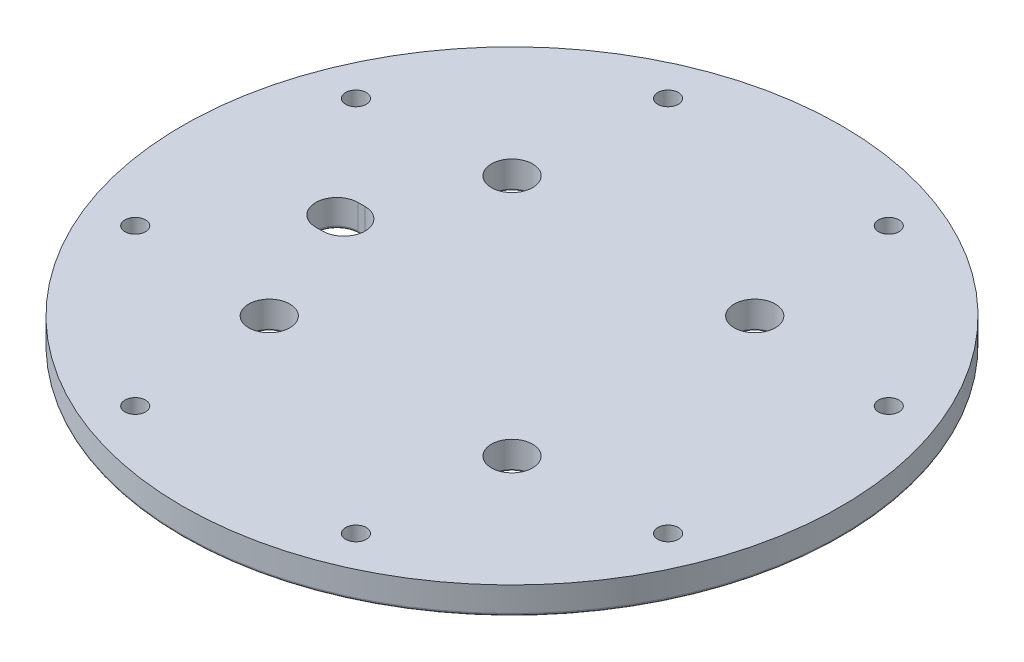
ISO-10303-21;
HEADER;
FILE_DESCRIPTION(('STEP AP214'),'2;1');
FILE_NAME('part.step','',(''),(''),'','','');
FILE_SCHEMA(('AUTOMOTIVE_DESIGN { 1 0 10303 214 1 1 1 1 }'));
ENDSEC;
DATA;
#1=APPLICATION_CONTEXT('core data for automotive mechanical design processes');
#2=APPLICATION_PROTOCOL_DEFINITION('international standard','automotive_design',2000,#1);
#3=PRODUCT_CONTEXT('',#1,'mechanical');
#4=PRODUCT('Part','Part','',(#3));
#5=PRODUCT_RELATED_PRODUCT_CATEGORY('part','',(#4));
#6=PRODUCT_DEFINITION_FORMATION('','',#4);
#7=PRODUCT_DEFINITION_CONTEXT('part definition',#1,'design');
#8=PRODUCT_DEFINITION('design','',#6,#7);
#9=PRODUCT_DEFINITION_SHAPE('','',#8);
#10=(LENGTH_UNIT() NAMED_UNIT(*) SI_UNIT(.MILLI.,.METRE.));
#11=(NAMED_UNIT(*) PLANE_ANGLE_UNIT() SI_UNIT($,.RADIAN.));
#12=(NAMED_UNIT(*) SI_UNIT($,.STERADIAN.) SOLID_ANGLE_UNIT());
#13=UNCERTAINTY_MEASURE_WITH_UNIT(LENGTH_MEASURE(1.E-05),#10,'distance_accuracy_value','');
#14=(GEOMETRIC_REPRESENTATION_CONTEXT(3) GLOBAL_UNCERTAINTY_ASSIGNED_CONTEXT((#13)) GLOBAL_UNIT_ASSIGNED_CONTEXT((#10,
#11,#12)) REPRESENTATION_CONTEXT('',''));
#15=CARTESIAN_POINT('',(0.,0.,0.));
#16=DIRECTION('',(0.,0.,1.));
#17=DIRECTION('',(1.,0.,0.));
#18=AXIS2_PLACEMENT_3D('',#15,#16,#17);
#19=CARTESIAN_POINT('',(0.,2.5,0.));
#20=DIRECTION('',(0.,-1.,0.));
#21=DIRECTION('',(0.,0.,-1.));
#22=AXIS2_PLACEMENT_3D('',#19,#20,#21);
#23=PLANE('',#22);
#24=CARTESIAN_POINT('',(0.,2.5,0.));
#25=DIRECTION('',(0.,-1.,0.));
#26=DIRECTION('',(0.,0.,-1.));
#27=AXIS2_PLACEMENT_3D('',#24,#25,#26);
#28=CIRCLE('',#27,16.);
#29=CARTESIAN_POINT('',(0.,2.5,-16.));
#30=VERTEX_POINT('',#29);
#31=EDGE_CURVE('E779',#30,#30,#28,.T.);
#32=ORIENTED_EDGE('',*,*,#31,.T.);
#33=EDGE_LOOP('',(#32));
#34=FACE_BOUND('',#33,.T.);
#35=ADVANCED_FACE('F17',(#34),#23,.T.);
#36=CARTESIAN_POINT('',(0.,2.5,0.));
#37=DIRECTION('',(0.,-1.,0.));
#38=DIRECTION('',(0.,0.,-1.));
#39=AXIS2_PLACEMENT_3D('',#36,#37,#38);
#40=CYLINDRICAL_SURFACE('',#39,16.);
#41=ORIENTED_EDGE('',*,*,#31,.F.);
#42=EDGE_LOOP('',(#41));
#43=FACE_BOUND('',#42,.T.);
#44=CARTESIAN_POINT('',(0.,0.4,0.));
#45=DIRECTION('',(0.,1.,0.));
#46=DIRECTION('',(0.,0.,1.));
#47=AXIS2_PLACEMENT_3D('',#44,#45,#46);
#48=CIRCLE('',#47,16.);
#49=CARTESIAN_POINT('',(0.,0.4,16.));
#50=VERTEX_POINT('',#49);
#51=EDGE_CURVE('E334',#50,#50,#48,.T.);
#52=ORIENTED_EDGE('',*,*,#51,.F.);
#53=EDGE_LOOP('',(#52));
#54=FACE_BOUND('',#53,.T.);
#55=ADVANCED_FACE('F850',(#43,#54),#40,.F.);
#56=CARTESIAN_POINT('',(0.,0.4,0.));
#57=DIRECTION('',(0.,1.,0.));
#58=DIRECTION('',(0.,0.,1.));
#59=AXIS2_PLACEMENT_3D('',#56,#57,#58);
#60=TOROIDAL_SURFACE('',#59,16.4,0.4);
#61=CARTESIAN_POINT('',(0.,0.,0.));
#62=DIRECTION('',(0.,-1.,0.));
#63=DIRECTION('',(0.,0.,1.));
#64=AXIS2_PLACEMENT_3D('',#61,#62,#63);
#65=CIRCLE('',#64,16.4);
#66=CARTESIAN_POINT('',(0.,0.,16.4));
#67=VERTEX_POINT('',#66);
#68=CARTESIAN_POINT('',(0.,0.,-16.4));
#69=VERTEX_POINT('',#68);
#70=EDGE_CURVE('E134',#67,#69,#65,.T.);
#71=ORIENTED_EDGE('',*,*,#70,.T.);
#72=CARTESIAN_POINT('',(0.,0.,0.));
#73=DIRECTION('',(0.,-1.,0.));
#74=DIRECTION('',(0.,0.,-1.));
#75=AXIS2_PLACEMENT_3D('',#72,#73,#74);
#76=CIRCLE('',#75,16.4);
#77=EDGE_CURVE('E138',#69,#67,#76,.T.);
#78=ORIENTED_EDGE('',*,*,#77,.T.);
#79=EDGE_LOOP('',(#71,#78));
#80=FACE_BOUND('',#79,.T.);
#81=ORIENTED_EDGE('',*,*,#51,.T.);
#82=EDGE_LOOP('',(#81));
#83=FACE_BOUND('',#82,.T.);
#84=ADVANCED_FACE('F136',(#80,#83),#60,.T.);
#85=CARTESIAN_POINT('',(-25.5,0.4,3.5));
#86=DIRECTION('',(-1.,0.,0.));
#87=DIRECTION('',(0.,0.,1.));
#88=AXIS2_PLACEMENT_3D('',#85,#86,#87);
#89=CYLINDRICAL_SURFACE('',#88,0.4);
#90=CARTESIAN_POINT('',(-25.5,0.4,3.5));
#91=DIRECTION('',(1.,0.,0.));
#92=DIRECTION('',(0.,0.,1.));
#93=AXIS2_PLACEMENT_3D('',#90,#91,#92);
#94=CIRCLE('',#93,0.4);
#95=CARTESIAN_POINT('',(-25.5,0.4,3.1));
#96=VERTEX_POINT('',#95);
#97=CARTESIAN_POINT('',(-25.5,0.,3.5));
#98=VERTEX_POINT('',#97);
#99=EDGE_CURVE('E519',#96,#98,#94,.F.);
#100=ORIENTED_EDGE('',*,*,#99,.F.);
#101=DIRECTION('',(1.,0.,0.));
#102=VECTOR('',#101,1.);
#103=CARTESIAN_POINT('',(-25.5,0.4,3.1));
#104=LINE('',#103,#102);
#105=CARTESIAN_POINT('',(-24.5,0.4,3.1));
#106=VERTEX_POINT('',#105);
#107=EDGE_CURVE('E1153',#96,#106,#104,.T.);
#108=ORIENTED_EDGE('',*,*,#107,.T.);
#109=CARTESIAN_POINT('',(-24.5,0.4,3.5));
#110=DIRECTION('',(1.,0.,0.));
#111=DIRECTION('',(0.,0.,1.));
#112=AXIS2_PLACEMENT_3D('',#109,#110,#111);
#113=CIRCLE('',#112,0.4);
#114=CARTESIAN_POINT('',(-24.5,0.,3.5));
#115=VERTEX_POINT('',#114);
#116=EDGE_CURVE('E1155',#115,#106,#113,.T.);
#117=ORIENTED_EDGE('',*,*,#116,.F.);
#118=DIRECTION('',(1.,0.,0.));
#119=VECTOR('',#118,1.);
#120=CARTESIAN_POINT('',(0.,0.,3.5));
#121=LINE('',#120,#119);
#122=EDGE_CURVE('E330',#115,#98,#121,.F.);
#123=ORIENTED_EDGE('',*,*,#122,.T.);
#124=EDGE_LOOP('',(#100,#108,#117,#123));
#125=FACE_BOUND('',#124,.T.);
#126=ADVANCED_FACE('F838',(#125),#89,.T.);
#127=CARTESIAN_POINT('',(-25.5,0.4,-3.5));
#128=DIRECTION('',(1.,0.,0.));
#129=DIRECTION('',(0.,0.,-1.));
#130=AXIS2_PLACEMENT_3D('',#127,#128,#129);
#131=CYLINDRICAL_SURFACE('',#130,0.4);
#132=CARTESIAN_POINT('',(-24.5,0.4,-3.5));
#133=DIRECTION('',(-1.,0.,0.));
#134=DIRECTION('',(0.,0.,-1.));
#135=AXIS2_PLACEMENT_3D('',#132,#133,#134);
#136=CIRCLE('',#135,0.4);
#137=CARTESIAN_POINT('',(-24.5,0.4,-3.1));
#138=VERTEX_POINT('',#137);
#139=CARTESIAN_POINT('',(-24.5,0.,-3.5));
#140=VERTEX_POINT('',#139);
#141=EDGE_CURVE('E55',#138,#140,#136,.F.);
#142=ORIENTED_EDGE('',*,*,#141,.F.);
#143=DIRECTION('',(-1.,0.,0.));
#144=VECTOR('',#143,1.);
#145=CARTESIAN_POINT('',(-25.5,0.4,-3.1));
#146=LINE('',#145,#144);
#147=CARTESIAN_POINT('',(-25.5,0.4,-3.1));
#148=VERTEX_POINT('',#147);
#149=EDGE_CURVE('E457',#138,#148,#146,.T.);
#150=ORIENTED_EDGE('',*,*,#149,.T.);
#151=CARTESIAN_POINT('',(-25.5,0.4,-3.5));
#152=DIRECTION('',(-1.,0.,0.));
#153=DIRECTION('',(0.,0.,-1.));
#154=AXIS2_PLACEMENT_3D('',#151,#152,#153);
#155=CIRCLE('',#154,0.4);
#156=CARTESIAN_POINT('',(-25.5,0.,-3.5));
#157=VERTEX_POINT('',#156);
#158=EDGE_CURVE('E524',#157,#148,#155,.T.);
#159=ORIENTED_EDGE('',*,*,#158,.F.);
#160=DIRECTION('',(1.,0.,0.));
#161=VECTOR('',#160,1.);
#162=CARTESIAN_POINT('',(0.,0.,-3.5));
#163=LINE('',#162,#161);
#164=EDGE_CURVE('E142',#157,#140,#163,.T.);
#165=ORIENTED_EDGE('',*,*,#164,.T.);
#166=EDGE_LOOP('',(#142,#150,#159,#165));
#167=FACE_BOUND('',#166,.T.);
#168=ADVANCED_FACE('F168',(#167),#131,.T.);
#169=CARTESIAN_POINT('',(0.,0.,0.));
#170=DIRECTION('',(0.,1.,0.));
#171=DIRECTION('',(0.,0.,1.));
#172=AXIS2_PLACEMENT_3D('',#169,#170,#171);
#173=PLANE('',#172);
#174=CARTESIAN_POINT('',(0.,0.,0.));
#175=DIRECTION('',(0.,1.,0.));
#176=DIRECTION('',(0.,0.,1.));
#177=AXIS2_PLACEMENT_3D('',#174,#175,#176);
#178=CIRCLE('',#177,47.6);
#179=CARTESIAN_POINT('',(0.,0.,47.6));
#180=VERTEX_POINT('',#179);
#181=CARTESIAN_POINT('',(0.,0.,-47.6));
#182=VERTEX_POINT('',#181);
#183=EDGE_CURVE('E339',#180,#182,#178,.T.);
#184=ORIENTED_EDGE('',*,*,#183,.F.);
#185=CARTESIAN_POINT('',(0.,0.,0.));
#186=DIRECTION('',(0.,1.,0.));
#187=DIRECTION('',(0.,0.,-1.));
#188=AXIS2_PLACEMENT_3D('',#185,#186,#187);
#189=CIRCLE('',#188,47.6);
#190=EDGE_CURVE('E319',#182,#180,#189,.T.);
#191=ORIENTED_EDGE('',*,*,#190,.F.);
#192=EDGE_LOOP('',(#184,#191));
#193=FACE_BOUND('',#192,.T.);
#194=CARTESIAN_POINT('',(-17.6776695296637,0.,-17.6776695296637));
#195=DIRECTION('',(0.,-1.,0.));
#196=DIRECTION('',(0.,0.,1.));
#197=AXIS2_PLACEMENT_3D('',#194,#195,#196);
#198=CIRCLE('',#197,3.2);
#199=CARTESIAN_POINT('',(-17.6776695296637,0.,-14.4776695296637));
#200=VERTEX_POINT('',#199);
#201=CARTESIAN_POINT('',(-17.6776695296637,0.,-20.8776695296637));
#202=VERTEX_POINT('',#201);
#203=EDGE_CURVE('E806',#200,#202,#198,.T.);
#204=ORIENTED_EDGE('',*,*,#203,.F.);
#205=CARTESIAN_POINT('',(-17.6776695296637,0.,-17.6776695296637));
#206=DIRECTION('',(0.,-1.,0.));
#207=DIRECTION('',(0.,0.,-1.));
#208=AXIS2_PLACEMENT_3D('',#205,#206,#207);
#209=CIRCLE('',#208,3.2);
#210=EDGE_CURVE('E796',#202,#200,#209,.T.);
#211=ORIENTED_EDGE('',*,*,#210,.F.);
#212=EDGE_LOOP('',(#204,#211));
#213=FACE_BOUND('',#212,.T.);
#214=CARTESIAN_POINT('',(-17.6776695296636,0.,17.6776695296637));
#215=DIRECTION('',(0.,-1.,0.));
#216=DIRECTION('',(0.,0.,1.));
#217=AXIS2_PLACEMENT_3D('',#214,#215,#216);
#218=CIRCLE('',#217,3.2);
#219=CARTESIAN_POINT('',(-17.6776695296636,0.,20.8776695296637));
#220=VERTEX_POINT('',#219);
#221=CARTESIAN_POINT('',(-17.6776695296636,0.,14.4776695296637));
#222=VERTEX_POINT('',#221);
#223=EDGE_CURVE('E1094',#220,#222,#218,.T.);
#224=ORIENTED_EDGE('',*,*,#223,.F.);
#225=CARTESIAN_POINT('',(-17.6776695296636,0.,17.6776695296637));
#226=DIRECTION('',(0.,-1.,0.));
#227=DIRECTION('',(0.,0.,-1.));
#228=AXIS2_PLACEMENT_3D('',#225,#226,#227);
#229=CIRCLE('',#228,3.2);
#230=EDGE_CURVE('E426',#222,#220,#229,.T.);
#231=ORIENTED_EDGE('',*,*,#230,.F.);
#232=EDGE_LOOP('',(#224,#231));
#233=FACE_BOUND('',#232,.T.);
#234=CARTESIAN_POINT('',(17.6776695296637,0.,17.6776695296637));
#235=DIRECTION('',(0.,-1.,0.));
#236=DIRECTION('',(0.,0.,1.));
#237=AXIS2_PLACEMENT_3D('',#234,#235,#236);
#238=CIRCLE('',#237,3.2);
#239=CARTESIAN_POINT('',(17.6776695296637,0.,20.8776695296637));
#240=VERTEX_POINT('',#239);
#241=CARTESIAN_POINT('',(17.6776695296637,0.,14.4776695296637));
#242=VERTEX_POINT('',#241);
#243=EDGE_CURVE('E1081',#240,#242,#238,.T.);
#244=ORIENTED_EDGE('',*,*,#243,.F.);
#245=CARTESIAN_POINT('',(17.6776695296637,0.,17.6776695296637));
#246=DIRECTION('',(0.,-1.,0.));
#247=DIRECTION('',(0.,0.,-1.));
#248=AXIS2_PLACEMENT_3D('',#245,#246,#247);
#249=CIRCLE('',#248,3.2);
#250=EDGE_CURVE('E410',#242,#240,#249,.T.);
#251=ORIENTED_EDGE('',*,*,#250,.F.);
#252=EDGE_LOOP('',(#244,#251));
#253=FACE_BOUND('',#252,.T.);
#254=CARTESIAN_POINT('',(17.6776695296635,0.,-17.6776695296639));
#255=DIRECTION('',(0.,-1.,0.));
#256=DIRECTION('',(0.,0.,1.));
#257=AXIS2_PLACEMENT_3D('',#254,#255,#256);
#258=CIRCLE('',#257,3.2);
#259=CARTESIAN_POINT('',(17.6776695296635,0.,-14.4776695296639));
#260=VERTEX_POINT('',#259);
#261=CARTESIAN_POINT('',(17.6776695296635,0.,-20.8776695296639));
#262=VERTEX_POINT('',#261);
#263=EDGE_CURVE('E809',#260,#262,#258,.T.);
#264=ORIENTED_EDGE('',*,*,#263,.F.);
#265=CARTESIAN_POINT('',(17.6776695296635,0.,-17.6776695296639));
#266=DIRECTION('',(0.,-1.,0.));
#267=DIRECTION('',(0.,0.,-1.));
#268=AXIS2_PLACEMENT_3D('',#265,#266,#267);
#269=CIRCLE('',#268,3.19999999999999);
#270=EDGE_CURVE('E1084',#262,#260,#269,.T.);
#271=ORIENTED_EDGE('',*,*,#270,.F.);
#272=EDGE_LOOP('',(#264,#271));
#273=FACE_BOUND('',#272,.T.);
#274=ORIENTED_EDGE('',*,*,#70,.F.);
#275=ORIENTED_EDGE('',*,*,#77,.F.);
#276=EDGE_LOOP('',(#274,#275));
#277=FACE_BOUND('',#276,.T.);
#278=ORIENTED_EDGE('',*,*,#164,.F.);
#279=CARTESIAN_POINT('',(-25.5,0.,0.));
#280=DIRECTION('',(0.,-1.,0.));
#281=DIRECTION('',(0.,0.,1.));
#282=AXIS2_PLACEMENT_3D('',#279,#280,#281);
#283=CIRCLE('',#282,3.5);
#284=EDGE_CURVE('E494',#98,#157,#283,.T.);
#285=ORIENTED_EDGE('',*,*,#284,.F.);
#286=ORIENTED_EDGE('',*,*,#122,.F.);
#287=CARTESIAN_POINT('',(-24.5,0.,0.));
#288=DIRECTION('',(0.,-1.,0.));
#289=DIRECTION('',(0.,0.,-1.));
#290=AXIS2_PLACEMENT_3D('',#287,#288,#289);
#291=CIRCLE('',#290,3.5);
#292=EDGE_CURVE('E458',#140,#115,#291,.T.);
#293=ORIENTED_EDGE('',*,*,#292,.F.);
#294=EDGE_LOOP('',(#278,#285,#286,#293));
#295=FACE_BOUND('',#294,.T.);
#296=CARTESIAN_POINT('',(-38.802940365474,0.,-16.0727041593338));
#297=DIRECTION('',(0.,-1.,0.));
#298=DIRECTION('',(0.,0.,1.));
#299=AXIS2_PLACEMENT_3D('',#296,#297,#298);
#300=CIRCLE('',#299,1.9);
#301=CARTESIAN_POINT('',(-38.802940365474,0.,-14.1727041593338));
#302=VERTEX_POINT('',#301);
#303=CARTESIAN_POINT('',(-38.802940365474,0.,-17.9727041593338));
#304=VERTEX_POINT('',#303);
#305=EDGE_CURVE('E521',#302,#304,#300,.T.);
#306=ORIENTED_EDGE('',*,*,#305,.F.);
#307=CARTESIAN_POINT('',(-38.802940365474,0.,-16.0727041593338));
#308=DIRECTION('',(0.,-1.,0.));
#309=DIRECTION('',(0.,0.,-1.));
#310=AXIS2_PLACEMENT_3D('',#307,#308,#309);
#311=CIRCLE('',#310,1.90000000000001);
#312=EDGE_CURVE('E687',#304,#302,#311,.T.);
#313=ORIENTED_EDGE('',*,*,#312,.F.);
#314=EDGE_LOOP('',(#306,#313));
#315=FACE_BOUND('',#314,.T.);
#316=CARTESIAN_POINT('',(-38.802940365474,0.,16.0727041593338));
#317=DIRECTION('',(0.,-1.,0.));
#318=DIRECTION('',(0.,0.,1.));
#319=AXIS2_PLACEMENT_3D('',#316,#317,#318);
#320=CIRCLE('',#319,1.90000000000001);
#321=CARTESIAN_POINT('',(-38.802940365474,0.,17.9727041593338));
#322=VERTEX_POINT('',#321);
#323=CARTESIAN_POINT('',(-38.802940365474,0.,14.1727041593338));
#324=VERTEX_POINT('',#323);
#325=EDGE_CURVE('E663',#322,#324,#320,.T.);
#326=ORIENTED_EDGE('',*,*,#325,.F.);
#327=CARTESIAN_POINT('',(-38.802940365474,0.,16.0727041593338));
#328=DIRECTION('',(0.,-1.,0.));
#329=DIRECTION('',(0.,0.,-1.));
#330=AXIS2_PLACEMENT_3D('',#327,#328,#329);
#331=CIRCLE('',#330,1.90000000000001);
#332=EDGE_CURVE('E147',#324,#322,#331,.T.);
#333=ORIENTED_EDGE('',*,*,#332,.F.);
#334=EDGE_LOOP('',(#326,#333));
#335=FACE_BOUND('',#334,.T.);
#336=CARTESIAN_POINT('',(-16.0727041593337,0.,38.8029403654741));
#337=DIRECTION('',(0.,-1.,0.));
#338=DIRECTION('',(0.,0.,1.));
#339=AXIS2_PLACEMENT_3D('',#336,#337,#338);
#340=CIRCLE('',#339,1.90000000000001);
#341=CARTESIAN_POINT('',(-16.0727041593337,0.,40.7029403654741));
#342=VERTEX_POINT('',#341);
#343=CARTESIAN_POINT('',(-16.0727041593337,0.,36.9029403654741));
#344=VERTEX_POINT('',#343);
#345=EDGE_CURVE('E667',#342,#344,#340,.T.);
#346=ORIENTED_EDGE('',*,*,#345,.F.);
#347=CARTESIAN_POINT('',(-16.0727041593337,0.,38.8029403654741));
#348=DIRECTION('',(0.,-1.,0.));
#349=DIRECTION('',(0.,0.,-1.));
#350=AXIS2_PLACEMENT_3D('',#347,#348,#349);
#351=CIRCLE('',#350,1.90000000000001);
#352=EDGE_CURVE('E643',#344,#342,#351,.T.);
#353=ORIENTED_EDGE('',*,*,#352,.F.);
#354=EDGE_LOOP('',(#346,#353));
#355=FACE_BOUND('',#354,.T.);
#356=CARTESIAN_POINT('',(16.0727041593339,0.,38.802940365474));
#357=DIRECTION('',(0.,-1.,0.));
#358=DIRECTION('',(0.,0.,1.));
#359=AXIS2_PLACEMENT_3D('',#356,#357,#358);
#360=CIRCLE('',#359,1.90000000000001);
#361=CARTESIAN_POINT('',(16.0727041593339,0.,40.702940365474));
#362=VERTEX_POINT('',#361);
#363=CARTESIAN_POINT('',(16.0727041593339,0.,36.902940365474));
#364=VERTEX_POINT('',#363);
#365=EDGE_CURVE('E669',#362,#364,#360,.T.);
#366=ORIENTED_EDGE('',*,*,#365,.F.);
#367=CARTESIAN_POINT('',(16.0727041593339,0.,38.802940365474));
#368=DIRECTION('',(0.,-1.,0.));
#369=DIRECTION('',(0.,0.,-1.));
#370=AXIS2_PLACEMENT_3D('',#367,#368,#369);
#371=CIRCLE('',#370,1.90000000000001);
#372=EDGE_CURVE('E668',#364,#362,#371,.T.);
#373=ORIENTED_EDGE('',*,*,#372,.F.);
#374=EDGE_LOOP('',(#366,#373));
#375=FACE_BOUND('',#374,.T.);
#376=CARTESIAN_POINT('',(38.802940365474,0.,16.0727041593338));
#377=DIRECTION('',(0.,-1.,0.));
#378=DIRECTION('',(0.,0.,1.));
#379=AXIS2_PLACEMENT_3D('',#376,#377,#378);
#380=CIRCLE('',#379,1.90000000000001);
#381=CARTESIAN_POINT('',(38.802940365474,0.,17.9727041593338));
#382=VERTEX_POINT('',#381);
#383=CARTESIAN_POINT('',(38.802940365474,0.,14.1727041593338));
#384=VERTEX_POINT('',#383);
#385=EDGE_CURVE('E674',#382,#384,#380,.T.);
#386=ORIENTED_EDGE('',*,*,#385,.F.);
#387=CARTESIAN_POINT('',(38.802940365474,0.,16.0727041593338));
#388=DIRECTION('',(0.,-1.,0.));
#389=DIRECTION('',(0.,0.,-1.));
#390=AXIS2_PLACEMENT_3D('',#387,#388,#389);
#391=CIRCLE('',#390,1.90000000000001);
#392=EDGE_CURVE('E673',#384,#382,#391,.T.);
#393=ORIENTED_EDGE('',*,*,#392,.F.);
#394=EDGE_LOOP('',(#386,#393));
#395=FACE_BOUND('',#394,.T.);
#396=CARTESIAN_POINT('',(38.8029403654739,0.,-16.0727041593341));
#397=DIRECTION('',(0.,-1.,0.));
#398=DIRECTION('',(0.,0.,1.));
#399=AXIS2_PLACEMENT_3D('',#396,#397,#398);
#400=CIRCLE('',#399,1.9);
#401=CARTESIAN_POINT('',(38.8029403654739,0.,-14.1727041593341));
#402=VERTEX_POINT('',#401);
#403=CARTESIAN_POINT('',(38.8029403654739,0.,-17.9727041593341));
#404=VERTEX_POINT('',#403);
#405=EDGE_CURVE('E679',#402,#404,#400,.T.);
#406=ORIENTED_EDGE('',*,*,#405,.F.);
#407=CARTESIAN_POINT('',(38.8029403654739,0.,-16.0727041593341));
#408=DIRECTION('',(0.,-1.,0.));
#409=DIRECTION('',(0.,0.,-1.));
#410=AXIS2_PLACEMENT_3D('',#407,#408,#409);
#411=CIRCLE('',#410,1.90000000000001);
#412=EDGE_CURVE('E580',#404,#402,#411,.T.);
#413=ORIENTED_EDGE('',*,*,#412,.F.);
#414=EDGE_LOOP('',(#406,#413));
#415=FACE_BOUND('',#414,.T.);
#416=CARTESIAN_POINT('',(16.0727041593334,0.,-38.8029403654742));
#417=DIRECTION('',(0.,-1.,0.));
#418=DIRECTION('',(0.,0.,1.));
#419=AXIS2_PLACEMENT_3D('',#416,#417,#418);
#420=CIRCLE('',#419,1.90000000000001);
#421=CARTESIAN_POINT('',(16.0727041593334,0.,-36.9029403654742));
#422=VERTEX_POINT('',#421);
#423=CARTESIAN_POINT('',(16.0727041593334,0.,-40.7029403654742));
#424=VERTEX_POINT('',#423);
#425=EDGE_CURVE('E681',#422,#424,#420,.T.);
#426=ORIENTED_EDGE('',*,*,#425,.F.);
#427=CARTESIAN_POINT('',(16.0727041593334,0.,-38.8029403654742));
#428=DIRECTION('',(0.,-1.,0.));
#429=DIRECTION('',(0.,0.,-1.));
#430=AXIS2_PLACEMENT_3D('',#427,#428,#429);
#431=CIRCLE('',#430,1.90000000000001);
#432=EDGE_CURVE('E567',#424,#422,#431,.T.);
#433=ORIENTED_EDGE('',*,*,#432,.F.);
#434=EDGE_LOOP('',(#426,#433));
#435=FACE_BOUND('',#434,.T.);
#436=CARTESIAN_POINT('',(-16.0727041593342,0.,-38.8029403654739));
#437=DIRECTION('',(0.,-1.,0.));
#438=DIRECTION('',(0.,0.,1.));
#439=AXIS2_PLACEMENT_3D('',#436,#437,#438);
#440=CIRCLE('',#439,1.90000000000001);
#441=CARTESIAN_POINT('',(-16.0727041593342,0.,-36.9029403654739));
#442=VERTEX_POINT('',#441);
#443=CARTESIAN_POINT('',(-16.0727041593342,0.,-40.7029403654739));
#444=VERTEX_POINT('',#443);
#445=EDGE_CURVE('E683',#442,#444,#440,.T.);
#446=ORIENTED_EDGE('',*,*,#445,.F.);
#447=CARTESIAN_POINT('',(-16.0727041593342,0.,-38.8029403654739));
#448=DIRECTION('',(0.,-1.,0.));
#449=DIRECTION('',(0.,0.,-1.));
#450=AXIS2_PLACEMENT_3D('',#447,#448,#449);
#451=CIRCLE('',#450,1.90000000000001);
#452=EDGE_CURVE('E682',#444,#442,#451,.T.);
#453=ORIENTED_EDGE('',*,*,#452,.F.);
#454=EDGE_LOOP('',(#446,#453));
#455=FACE_BOUND('',#454,.T.);
#456=ADVANCED_FACE('F145',(#193,#213,#233,#253,#273,#277,#295,#315,#335,#355,#375,#395,#415,
#435,#455),#173,.F.);
#457=CARTESIAN_POINT('',(-38.802940365474,0.4,16.0727041593338));
#458=DIRECTION('',(0.,1.,0.));
#459=DIRECTION('',(0.,0.,1.));
#460=AXIS2_PLACEMENT_3D('',#457,#458,#459);
#461=TOROIDAL_SURFACE('',#460,1.90000000000001,0.4);
#462=CARTESIAN_POINT('',(-38.802940365474,0.4,16.0727041593338));
#463=DIRECTION('',(0.,-1.,0.));
#464=DIRECTION('',(0.,0.,-1.));
#465=AXIS2_PLACEMENT_3D('',#462,#463,#464);
#466=CIRCLE('',#465,1.50000000000001);
#467=CARTESIAN_POINT('',(-38.802940365474,0.4,14.5727041593338));
#468=VERTEX_POINT('',#467);
#469=EDGE_CURVE('E811',#468,#468,#466,.F.);
#470=ORIENTED_EDGE('',*,*,#469,.T.);
#471=EDGE_LOOP('',(#470));
#472=FACE_BOUND('',#471,.T.);
#473=ORIENTED_EDGE('',*,*,#325,.T.);
#474=ORIENTED_EDGE('',*,*,#332,.T.);
#475=EDGE_LOOP('',(#473,#474));
#476=FACE_BOUND('',#475,.T.);
#477=ADVANCED_FACE('F167',(#472,#476),#461,.T.);
#478=CARTESIAN_POINT('',(-16.0727041593337,0.4,38.8029403654741));
#479=DIRECTION('',(0.,1.,0.));
#480=DIRECTION('',(0.,0.,1.));
#481=AXIS2_PLACEMENT_3D('',#478,#479,#480);
#482=TOROIDAL_SURFACE('',#481,1.90000000000001,0.4);
#483=CARTESIAN_POINT('',(-16.0727041593337,0.4,38.8029403654741));
#484=DIRECTION('',(0.,-1.,0.));
#485=DIRECTION('',(0.,0.,-1.));
#486=AXIS2_PLACEMENT_3D('',#483,#484,#485);
#487=CIRCLE('',#486,1.5);
#488=CARTESIAN_POINT('',(-16.0727041593337,0.4,37.3029403654741));
#489=VERTEX_POINT('',#488);
#490=EDGE_CURVE('E614',#489,#489,#487,.F.);
#491=ORIENTED_EDGE('',*,*,#490,.T.);
#492=EDGE_LOOP('',(#491));
#493=FACE_BOUND('',#492,.T.);
#494=ORIENTED_EDGE('',*,*,#345,.T.);
#495=ORIENTED_EDGE('',*,*,#352,.T.);
#496=EDGE_LOOP('',(#494,#495));
#497=FACE_BOUND('',#496,.T.);
#498=ADVANCED_FACE('F621',(#493,#497),#482,.T.);
#499=CARTESIAN_POINT('',(16.0727041593339,0.4,38.802940365474));
#500=DIRECTION('',(0.,1.,0.));
#501=DIRECTION('',(0.,0.,1.));
#502=AXIS2_PLACEMENT_3D('',#499,#500,#501);
#503=TOROIDAL_SURFACE('',#502,1.90000000000001,0.4);
#504=CARTESIAN_POINT('',(16.0727041593339,0.4,38.802940365474));
#505=DIRECTION('',(0.,-1.,0.));
#506=DIRECTION('',(0.,0.,-1.));
#507=AXIS2_PLACEMENT_3D('',#504,#505,#506);
#508=CIRCLE('',#507,1.5);
#509=CARTESIAN_POINT('',(16.0727041593339,0.4,37.302940365474));
#510=VERTEX_POINT('',#509);
#511=EDGE_CURVE('E609',#510,#510,#508,.F.);
#512=ORIENTED_EDGE('',*,*,#511,.T.);
#513=EDGE_LOOP('',(#512));
#514=FACE_BOUND('',#513,.T.);
#515=ORIENTED_EDGE('',*,*,#365,.T.);
#516=ORIENTED_EDGE('',*,*,#372,.T.);
#517=EDGE_LOOP('',(#515,#516));
#518=FACE_BOUND('',#517,.T.);
#519=ADVANCED_FACE('F618',(#514,#518),#503,.T.);
#520=CARTESIAN_POINT('',(38.802940365474,0.4,16.0727041593338));
#521=DIRECTION('',(0.,1.,0.));
#522=DIRECTION('',(0.,0.,1.));
#523=AXIS2_PLACEMENT_3D('',#520,#521,#522);
#524=TOROIDAL_SURFACE('',#523,1.90000000000001,0.4);
#525=CARTESIAN_POINT('',(38.802940365474,0.4,16.0727041593338));
#526=DIRECTION('',(0.,-1.,0.));
#527=DIRECTION('',(0.,0.,-1.));
#528=AXIS2_PLACEMENT_3D('',#525,#526,#527);
#529=CIRCLE('',#528,1.50000000000001);
#530=CARTESIAN_POINT('',(38.802940365474,0.4,14.5727041593338));
#531=VERTEX_POINT('',#530);
#532=EDGE_CURVE('E607',#531,#531,#529,.F.);
#533=ORIENTED_EDGE('',*,*,#532,.T.);
#534=EDGE_LOOP('',(#533));
#535=FACE_BOUND('',#534,.T.);
#536=ORIENTED_EDGE('',*,*,#385,.T.);
#537=ORIENTED_EDGE('',*,*,#392,.T.);
#538=EDGE_LOOP('',(#536,#537));
#539=FACE_BOUND('',#538,.T.);
#540=ADVANCED_FACE('F596',(#535,#539),#524,.T.);
#541=CARTESIAN_POINT('',(38.8029403654739,0.4,-16.0727041593341));
#542=DIRECTION('',(0.,1.,0.));
#543=DIRECTION('',(0.,0.,1.));
#544=AXIS2_PLACEMENT_3D('',#541,#542,#543);
#545=TOROIDAL_SURFACE('',#544,1.9,0.4);
#546=CARTESIAN_POINT('',(38.8029403654739,0.4,-16.0727041593341));
#547=DIRECTION('',(0.,-1.,0.));
#548=DIRECTION('',(0.,0.,-1.));
#549=AXIS2_PLACEMENT_3D('',#546,#547,#548);
#550=CIRCLE('',#549,1.50000000000001);
#551=CARTESIAN_POINT('',(38.8029403654739,0.4,-17.5727041593341));
#552=VERTEX_POINT('',#551);
#553=EDGE_CURVE('E606',#552,#552,#550,.F.);
#554=ORIENTED_EDGE('',*,*,#553,.T.);
#555=EDGE_LOOP('',(#554));
#556=FACE_BOUND('',#555,.T.);
#557=ORIENTED_EDGE('',*,*,#405,.T.);
#558=ORIENTED_EDGE('',*,*,#412,.T.);
#559=EDGE_LOOP('',(#557,#558));
#560=FACE_BOUND('',#559,.T.);
#561=ADVANCED_FACE('F586',(#556,#560),#545,.T.);
#562=CARTESIAN_POINT('',(16.0727041593334,0.4,-38.8029403654742));
#563=DIRECTION('',(0.,1.,0.));
#564=DIRECTION('',(0.,0.,1.));
#565=AXIS2_PLACEMENT_3D('',#562,#563,#564);
#566=TOROIDAL_SURFACE('',#565,1.90000000000001,0.4);
#567=CARTESIAN_POINT('',(16.0727041593334,0.4,-38.8029403654742));
#568=DIRECTION('',(0.,-1.,0.));
#569=DIRECTION('',(0.,0.,-1.));
#570=AXIS2_PLACEMENT_3D('',#567,#568,#569);
#571=CIRCLE('',#570,1.5);
#572=CARTESIAN_POINT('',(16.0727041593334,0.4,-40.3029403654742));
#573=VERTEX_POINT('',#572);
#574=EDGE_CURVE('E536',#573,#573,#571,.F.);
#575=ORIENTED_EDGE('',*,*,#574,.T.);
#576=EDGE_LOOP('',(#575));
#577=FACE_BOUND('',#576,.T.);
#578=ORIENTED_EDGE('',*,*,#425,.T.);
#579=ORIENTED_EDGE('',*,*,#432,.T.);
#580=EDGE_LOOP('',(#578,#579));
#581=FACE_BOUND('',#580,.T.);
#582=ADVANCED_FACE('F544',(#577,#581),#566,.T.);
#583=CARTESIAN_POINT('',(-16.0727041593342,0.4,-38.8029403654739));
#584=DIRECTION('',(0.,1.,0.));
#585=DIRECTION('',(0.,0.,1.));
#586=AXIS2_PLACEMENT_3D('',#583,#584,#585);
#587=TOROIDAL_SURFACE('',#586,1.90000000000001,0.4);
#588=CARTESIAN_POINT('',(-16.0727041593342,0.4,-38.8029403654739));
#589=DIRECTION('',(0.,-1.,0.));
#590=DIRECTION('',(0.,0.,-1.));
#591=AXIS2_PLACEMENT_3D('',#588,#589,#590);
#592=CIRCLE('',#591,1.5);
#593=CARTESIAN_POINT('',(-16.0727041593342,0.4,-40.3029403654739));
#594=VERTEX_POINT('',#593);
#595=EDGE_CURVE('E531',#594,#594,#592,.F.);
#596=ORIENTED_EDGE('',*,*,#595,.T.);
#597=EDGE_LOOP('',(#596));
#598=FACE_BOUND('',#597,.T.);
#599=ORIENTED_EDGE('',*,*,#445,.T.);
#600=ORIENTED_EDGE('',*,*,#452,.T.);
#601=EDGE_LOOP('',(#599,#600));
#602=FACE_BOUND('',#601,.T.);
#603=ADVANCED_FACE('F540',(#598,#602),#587,.T.);
#604=CARTESIAN_POINT('',(-38.802940365474,0.4,-16.0727041593338));
#605=DIRECTION('',(0.,1.,0.));
#606=DIRECTION('',(0.,0.,1.));
#607=AXIS2_PLACEMENT_3D('',#604,#605,#606);
#608=TOROIDAL_SURFACE('',#607,1.9,0.4);
#609=CARTESIAN_POINT('',(-38.802940365474,0.4,-16.0727041593338));
#610=DIRECTION('',(0.,-1.,0.));
#611=DIRECTION('',(0.,0.,-1.));
#612=AXIS2_PLACEMENT_3D('',#609,#610,#611);
#613=CIRCLE('',#612,1.50000000000001);
#614=CARTESIAN_POINT('',(-38.802940365474,0.4,-17.5727041593338));
#615=VERTEX_POINT('',#614);
#616=EDGE_CURVE('E528',#615,#615,#613,.F.);
#617=ORIENTED_EDGE('',*,*,#616,.T.);
#618=EDGE_LOOP('',(#617));
#619=FACE_BOUND('',#618,.T.);
#620=ORIENTED_EDGE('',*,*,#305,.T.);
#621=ORIENTED_EDGE('',*,*,#312,.T.);
#622=EDGE_LOOP('',(#620,#621));
#623=FACE_BOUND('',#622,.T.);
#624=ADVANCED_FACE('F510',(#619,#623),#608,.T.);
#625=CARTESIAN_POINT('',(-25.5,0.4,0.));
#626=DIRECTION('',(0.,1.,0.));
#627=DIRECTION('',(0.,0.,1.));
#628=AXIS2_PLACEMENT_3D('',#625,#626,#627);
#629=TOROIDAL_SURFACE('',#628,3.5,0.4);
#630=ORIENTED_EDGE('',*,*,#158,.T.);
#631=CARTESIAN_POINT('',(-25.5,0.4,0.));
#632=DIRECTION('',(0.,-1.,0.));
#633=DIRECTION('',(0.,0.,-1.));
#634=AXIS2_PLACEMENT_3D('',#631,#632,#633);
#635=CIRCLE('',#634,3.1);
#636=EDGE_CURVE('E1143',#148,#96,#635,.F.);
#637=ORIENTED_EDGE('',*,*,#636,.T.);
#638=ORIENTED_EDGE('',*,*,#99,.T.);
#639=ORIENTED_EDGE('',*,*,#284,.T.);
#640=EDGE_LOOP('',(#630,#637,#638,#639));
#641=FACE_BOUND('',#640,.T.);
#642=ADVANCED_FACE('F500',(#641),#629,.T.);
#643=CARTESIAN_POINT('',(-25.5,4.,3.1));
#644=DIRECTION('',(0.,0.,1.));
#645=DIRECTION('',(1.,0.,0.));
#646=AXIS2_PLACEMENT_3D('',#643,#644,#645);
#647=PLANE('',#646);
#648=ORIENTED_EDGE('',*,*,#107,.F.);
#649=DIRECTION('',(0.,-1.,0.));
#650=VECTOR('',#649,1.);
#651=CARTESIAN_POINT('',(-25.5,4.,3.1));
#652=LINE('',#651,#650);
#653=CARTESIAN_POINT('',(-25.5,4.,3.1));
#654=VERTEX_POINT('',#653);
#655=EDGE_CURVE('E1139',#96,#654,#652,.F.);
#656=ORIENTED_EDGE('',*,*,#655,.T.);
#657=DIRECTION('',(1.,0.,0.));
#658=VECTOR('',#657,1.);
#659=CARTESIAN_POINT('',(-25.5,4.,3.1));
#660=LINE('',#659,#658);
#661=CARTESIAN_POINT('',(-24.5,4.,3.1));
#662=VERTEX_POINT('',#661);
#663=EDGE_CURVE('E37',#662,#654,#660,.F.);
#664=ORIENTED_EDGE('',*,*,#663,.F.);
#665=DIRECTION('',(0.,-1.,0.));
#666=VECTOR('',#665,1.);
#667=CARTESIAN_POINT('',(-24.5,4.,3.1));
#668=LINE('',#667,#666);
#669=EDGE_CURVE('E464',#662,#106,#668,.T.);
#670=ORIENTED_EDGE('',*,*,#669,.T.);
#671=EDGE_LOOP('',(#648,#656,#664,#670));
#672=FACE_BOUND('',#671,.T.);
#673=ADVANCED_FACE('F474',(#672),#647,.F.);
#674=CARTESIAN_POINT('',(-24.5,0.4,0.));
#675=DIRECTION('',(0.,1.,0.));
#676=DIRECTION('',(0.,0.,1.));
#677=AXIS2_PLACEMENT_3D('',#674,#675,#676);
#678=TOROIDAL_SURFACE('',#677,3.5,0.4);
#679=ORIENTED_EDGE('',*,*,#141,.T.);
#680=ORIENTED_EDGE('',*,*,#292,.T.);
#681=ORIENTED_EDGE('',*,*,#116,.T.);
#682=CARTESIAN_POINT('',(-24.5,0.4,0.));
#683=DIRECTION('',(0.,-1.,0.));
#684=DIRECTION('',(0.,0.,-1.));
#685=AXIS2_PLACEMENT_3D('',#682,#683,#684);
#686=CIRCLE('',#685,3.1);
#687=EDGE_CURVE('E462',#106,#138,#686,.F.);
#688=ORIENTED_EDGE('',*,*,#687,.T.);
#689=EDGE_LOOP('',(#679,#680,#681,#688));
#690=FACE_BOUND('',#689,.T.);
#691=ADVANCED_FACE('F470',(#690),#678,.T.);
#692=CARTESIAN_POINT('',(-25.5,4.,-3.1));
#693=DIRECTION('',(0.,0.,-1.));
#694=DIRECTION('',(-1.,0.,0.));
#695=AXIS2_PLACEMENT_3D('',#692,#693,#694);
#696=PLANE('',#695);
#697=ORIENTED_EDGE('',*,*,#149,.F.);
#698=DIRECTION('',(0.,-1.,0.));
#699=VECTOR('',#698,1.);
#700=CARTESIAN_POINT('',(-24.5,4.,-3.1));
#701=LINE('',#700,#699);
#702=CARTESIAN_POINT('',(-24.5,4.,-3.1));
#703=VERTEX_POINT('',#702);
#704=EDGE_CURVE('E454',#138,#703,#701,.F.);
#705=ORIENTED_EDGE('',*,*,#704,.T.);
#706=DIRECTION('',(-1.,0.,0.));
#707=VECTOR('',#706,1.);
#708=CARTESIAN_POINT('',(-25.5,4.,-3.1));
#709=LINE('',#708,#707);
#710=CARTESIAN_POINT('',(-25.5,4.,-3.1));
#711=VERTEX_POINT('',#710);
#712=EDGE_CURVE('E455',#711,#703,#709,.F.);
#713=ORIENTED_EDGE('',*,*,#712,.F.);
#714=DIRECTION('',(0.,-1.,0.));
#715=VECTOR('',#714,1.);
#716=CARTESIAN_POINT('',(-25.5,4.,-3.1));
#717=LINE('',#716,#715);
#718=EDGE_CURVE('E530',#711,#148,#717,.T.);
#719=ORIENTED_EDGE('',*,*,#718,.T.);
#720=EDGE_LOOP('',(#697,#705,#713,#719));
#721=FACE_BOUND('',#720,.T.);
#722=ADVANCED_FACE('F442',(#721),#696,.F.);
#723=CARTESIAN_POINT('',(-17.6776695296636,0.2,17.6776695296637));
#724=DIRECTION('',(0.,1.,0.));
#725=DIRECTION('',(0.,0.,1.));
#726=AXIS2_PLACEMENT_3D('',#723,#724,#725);
#727=TOROIDAL_SURFACE('',#726,3.2,0.2);
#728=CARTESIAN_POINT('',(-17.6776695296636,0.2,17.6776695296637));
#729=DIRECTION('',(0.,1.,0.));
#730=DIRECTION('',(0.,0.,1.));
#731=AXIS2_PLACEMENT_3D('',#728,#729,#730);
#732=CIRCLE('',#731,3.);
#733=CARTESIAN_POINT('',(-17.6776695296636,0.2,20.6776695296637));
#734=VERTEX_POINT('',#733);
#735=EDGE_CURVE('E451',#734,#734,#732,.T.);
#736=ORIENTED_EDGE('',*,*,#735,.T.);
#737=EDGE_LOOP('',(#736));
#738=FACE_BOUND('',#737,.T.);
#739=ORIENTED_EDGE('',*,*,#223,.T.);
#740=ORIENTED_EDGE('',*,*,#230,.T.);
#741=EDGE_LOOP('',(#739,#740));
#742=FACE_BOUND('',#741,.T.);
#743=ADVANCED_FACE('F432',(#738,#742),#727,.T.);
#744=CARTESIAN_POINT('',(17.6776695296637,0.2,17.6776695296637));
#745=DIRECTION('',(0.,1.,0.));
#746=DIRECTION('',(0.,0.,1.));
#747=AXIS2_PLACEMENT_3D('',#744,#745,#746);
#748=TOROIDAL_SURFACE('',#747,3.2,0.2);
#749=CARTESIAN_POINT('',(17.6776695296637,0.2,17.6776695296637));
#750=DIRECTION('',(0.,1.,0.));
#751=DIRECTION('',(0.,0.,1.));
#752=AXIS2_PLACEMENT_3D('',#749,#750,#751);
#753=CIRCLE('',#752,3.);
#754=CARTESIAN_POINT('',(17.6776695296637,0.2,20.6776695296637));
#755=VERTEX_POINT('',#754);
#756=EDGE_CURVE('E450',#755,#755,#753,.T.);
#757=ORIENTED_EDGE('',*,*,#756,.T.);
#758=EDGE_LOOP('',(#757));
#759=FACE_BOUND('',#758,.T.);
#760=ORIENTED_EDGE('',*,*,#243,.T.);
#761=ORIENTED_EDGE('',*,*,#250,.T.);
#762=EDGE_LOOP('',(#760,#761));
#763=FACE_BOUND('',#762,.T.);
#764=ADVANCED_FACE('F382',(#759,#763),#748,.T.);
#765=CARTESIAN_POINT('',(17.6776695296635,0.2,-17.6776695296639));
#766=DIRECTION('',(0.,1.,0.));
#767=DIRECTION('',(0.,0.,1.));
#768=AXIS2_PLACEMENT_3D('',#765,#766,#767);
#769=TOROIDAL_SURFACE('',#768,3.2,0.2);
#770=CARTESIAN_POINT('',(17.6776695296635,0.2,-17.6776695296639));
#771=DIRECTION('',(0.,1.,0.));
#772=DIRECTION('',(0.,0.,1.));
#773=AXIS2_PLACEMENT_3D('',#770,#771,#772);
#774=CIRCLE('',#773,3.);
#775=CARTESIAN_POINT('',(17.6776695296635,0.2,-14.6776695296639));
#776=VERTEX_POINT('',#775);
#777=EDGE_CURVE('E374',#776,#776,#774,.T.);
#778=ORIENTED_EDGE('',*,*,#777,.T.);
#779=EDGE_LOOP('',(#778));
#780=FACE_BOUND('',#779,.T.);
#781=ORIENTED_EDGE('',*,*,#263,.T.);
#782=ORIENTED_EDGE('',*,*,#270,.T.);
#783=EDGE_LOOP('',(#781,#782));
#784=FACE_BOUND('',#783,.T.);
#785=ADVANCED_FACE('F378',(#780,#784),#769,.T.);
#786=CARTESIAN_POINT('',(-17.6776695296637,0.2,-17.6776695296637));
#787=DIRECTION('',(0.,1.,0.));
#788=DIRECTION('',(0.,0.,1.));
#789=AXIS2_PLACEMENT_3D('',#786,#787,#788);
#790=TOROIDAL_SURFACE('',#789,3.2,0.2);
#791=CARTESIAN_POINT('',(-17.6776695296637,0.2,-17.6776695296637));
#792=DIRECTION('',(0.,1.,0.));
#793=DIRECTION('',(0.,0.,1.));
#794=AXIS2_PLACEMENT_3D('',#791,#792,#793);
#795=CIRCLE('',#794,3.);
#796=CARTESIAN_POINT('',(-17.6776695296637,0.2,-14.6776695296637));
#797=VERTEX_POINT('',#796);
#798=EDGE_CURVE('E371',#797,#797,#795,.T.);
#799=ORIENTED_EDGE('',*,*,#798,.T.);
#800=EDGE_LOOP('',(#799));
#801=FACE_BOUND('',#800,.T.);
#802=ORIENTED_EDGE('',*,*,#203,.T.);
#803=ORIENTED_EDGE('',*,*,#210,.T.);
#804=EDGE_LOOP('',(#802,#803));
#805=FACE_BOUND('',#804,.T.);
#806=ADVANCED_FACE('F358',(#801,#805),#790,.T.);
#807=CARTESIAN_POINT('',(0.,0.4,0.));
#808=DIRECTION('',(0.,1.,0.));
#809=DIRECTION('',(0.,0.,1.));
#810=AXIS2_PLACEMENT_3D('',#807,#808,#809);
#811=TOROIDAL_SURFACE('',#810,47.6,0.4);
#812=CARTESIAN_POINT('',(0.,0.4,0.));
#813=DIRECTION('',(0.,-1.,0.));
#814=DIRECTION('',(0.,0.,-1.));
#815=AXIS2_PLACEMENT_3D('',#812,#813,#814);
#816=CIRCLE('',#815,48.);
#817=CARTESIAN_POINT('',(0.,0.4,-48.));
#818=VERTEX_POINT('',#817);
#819=EDGE_CURVE('E367',#818,#818,#816,.F.);
#820=ORIENTED_EDGE('',*,*,#819,.F.);
#821=EDGE_LOOP('',(#820));
#822=FACE_BOUND('',#821,.T.);
#823=ORIENTED_EDGE('',*,*,#183,.T.);
#824=ORIENTED_EDGE('',*,*,#190,.T.);
#825=EDGE_LOOP('',(#823,#824));
#826=FACE_BOUND('',#825,.T.);
#827=ADVANCED_FACE('F346',(#822,#826),#811,.T.);
#828=CARTESIAN_POINT('',(-38.802940365474,4.,16.0727041593338));
#829=DIRECTION('',(0.,-1.,0.));
#830=DIRECTION('',(0.,0.,-1.));
#831=AXIS2_PLACEMENT_3D('',#828,#829,#830);
#832=CYLINDRICAL_SURFACE('',#831,1.50000000000001);
#833=ORIENTED_EDGE('',*,*,#469,.F.);
#834=EDGE_LOOP('',(#833));
#835=FACE_BOUND('',#834,.T.);
#836=CARTESIAN_POINT('',(-38.802940365474,4.,16.0727041593338));
#837=DIRECTION('',(0.,-1.,0.));
#838=DIRECTION('',(0.,0.,-1.));
#839=AXIS2_PLACEMENT_3D('',#836,#837,#838);
#840=CIRCLE('',#839,1.50000000000001);
#841=CARTESIAN_POINT('',(-38.802940365474,4.,14.5727041593338));
#842=VERTEX_POINT('',#841);
#843=EDGE_CURVE('E770',#842,#842,#840,.T.);
#844=ORIENTED_EDGE('',*,*,#843,.F.);
#845=EDGE_LOOP('',(#844));
#846=FACE_BOUND('',#845,.T.);
#847=ADVANCED_FACE('F357',(#835,#846),#832,.F.);
#848=CARTESIAN_POINT('',(-16.0727041593337,4.,38.8029403654741));
#849=DIRECTION('',(0.,-1.,0.));
#850=DIRECTION('',(0.,0.,-1.));
#851=AXIS2_PLACEMENT_3D('',#848,#849,#850);
#852=CYLINDRICAL_SURFACE('',#851,1.5);
#853=ORIENTED_EDGE('',*,*,#490,.F.);
#854=EDGE_LOOP('',(#853));
#855=FACE_BOUND('',#854,.T.);
#856=CARTESIAN_POINT('',(-16.0727041593337,4.,38.8029403654741));
#857=DIRECTION('',(0.,-1.,0.));
#858=DIRECTION('',(0.,0.,-1.));
#859=AXIS2_PLACEMENT_3D('',#856,#857,#858);
#860=CIRCLE('',#859,1.5);
#861=CARTESIAN_POINT('',(-16.0727041593337,4.,37.3029403654741));
#862=VERTEX_POINT('',#861);
#863=EDGE_CURVE('E767',#862,#862,#860,.T.);
#864=ORIENTED_EDGE('',*,*,#863,.F.);
#865=EDGE_LOOP('',(#864));
#866=FACE_BOUND('',#865,.T.);
#867=ADVANCED_FACE('F754',(#855,#866),#852,.F.);
#868=CARTESIAN_POINT('',(16.0727041593339,4.,38.802940365474));
#869=DIRECTION('',(0.,-1.,0.));
#870=DIRECTION('',(0.,0.,-1.));
#871=AXIS2_PLACEMENT_3D('',#868,#869,#870);
#872=CYLINDRICAL_SURFACE('',#871,1.5);
#873=ORIENTED_EDGE('',*,*,#511,.F.);
#874=EDGE_LOOP('',(#873));
#875=FACE_BOUND('',#874,.T.);
#876=CARTESIAN_POINT('',(16.0727041593339,4.,38.802940365474));
#877=DIRECTION('',(0.,-1.,0.));
#878=DIRECTION('',(0.,0.,-1.));
#879=AXIS2_PLACEMENT_3D('',#876,#877,#878);
#880=CIRCLE('',#879,1.5);
#881=CARTESIAN_POINT('',(16.0727041593339,4.,37.302940365474));
#882=VERTEX_POINT('',#881);
#883=EDGE_CURVE('E769',#882,#882,#880,.T.);
#884=ORIENTED_EDGE('',*,*,#883,.F.);
#885=EDGE_LOOP('',(#884));
#886=FACE_BOUND('',#885,.T.);
#887=ADVANCED_FACE('F751',(#875,#886),#872,.F.);
#888=CARTESIAN_POINT('',(38.802940365474,4.,16.0727041593338));
#889=DIRECTION('',(0.,-1.,0.));
#890=DIRECTION('',(0.,0.,-1.));
#891=AXIS2_PLACEMENT_3D('',#888,#889,#890);
#892=CYLINDRICAL_SURFACE('',#891,1.50000000000001);
#893=ORIENTED_EDGE('',*,*,#532,.F.);
#894=EDGE_LOOP('',(#893));
#895=FACE_BOUND('',#894,.T.);
#896=CARTESIAN_POINT('',(38.802940365474,4.,16.0727041593338));
#897=DIRECTION('',(0.,-1.,0.));
#898=DIRECTION('',(0.,0.,-1.));
#899=AXIS2_PLACEMENT_3D('',#896,#897,#898);
#900=CIRCLE('',#899,1.50000000000001);
#901=CARTESIAN_POINT('',(38.802940365474,4.,14.5727041593338));
#902=VERTEX_POINT('',#901);
#903=EDGE_CURVE('E773',#902,#902,#900,.T.);
#904=ORIENTED_EDGE('',*,*,#903,.F.);
#905=EDGE_LOOP('',(#904));
#906=FACE_BOUND('',#905,.T.);
#907=ADVANCED_FACE('F747',(#895,#906),#892,.F.);
#908=CARTESIAN_POINT('',(38.8029403654739,4.,-16.0727041593341));
#909=DIRECTION('',(0.,-1.,0.));
#910=DIRECTION('',(0.,0.,-1.));
#911=AXIS2_PLACEMENT_3D('',#908,#909,#910);
#912=CYLINDRICAL_SURFACE('',#911,1.50000000000001);
#913=ORIENTED_EDGE('',*,*,#553,.F.);
#914=EDGE_LOOP('',(#913));
#915=FACE_BOUND('',#914,.T.);
#916=CARTESIAN_POINT('',(38.8029403654739,4.,-16.0727041593341));
#917=DIRECTION('',(0.,-1.,0.));
#918=DIRECTION('',(0.,0.,-1.));
#919=AXIS2_PLACEMENT_3D('',#916,#917,#918);
#920=CIRCLE('',#919,1.50000000000001);
#921=CARTESIAN_POINT('',(38.8029403654739,4.,-17.5727041593341));
#922=VERTEX_POINT('',#921);
#923=EDGE_CURVE('E1183',#922,#922,#920,.T.);
#924=ORIENTED_EDGE('',*,*,#923,.F.);
#925=EDGE_LOOP('',(#924));
#926=FACE_BOUND('',#925,.T.);
#927=ADVANCED_FACE('F743',(#915,#926),#912,.F.);
#928=CARTESIAN_POINT('',(16.0727041593334,4.,-38.8029403654742));
#929=DIRECTION('',(0.,-1.,0.));
#930=DIRECTION('',(0.,0.,-1.));
#931=AXIS2_PLACEMENT_3D('',#928,#929,#930);
#932=CYLINDRICAL_SURFACE('',#931,1.5);
#933=ORIENTED_EDGE('',*,*,#574,.F.);
#934=EDGE_LOOP('',(#933));
#935=FACE_BOUND('',#934,.T.);
#936=CARTESIAN_POINT('',(16.0727041593334,4.,-38.8029403654742));
#937=DIRECTION('',(0.,-1.,0.));
#938=DIRECTION('',(0.,0.,-1.));
#939=AXIS2_PLACEMENT_3D('',#936,#937,#938);
#940=CIRCLE('',#939,1.5);
#941=CARTESIAN_POINT('',(16.0727041593334,4.,-40.3029403654742));
#942=VERTEX_POINT('',#941);
#943=EDGE_CURVE('E1180',#942,#942,#940,.T.);
#944=ORIENTED_EDGE('',*,*,#943,.F.);
#945=EDGE_LOOP('',(#944));
#946=FACE_BOUND('',#945,.T.);
#947=ADVANCED_FACE('F739',(#935,#946),#932,.F.);
#948=CARTESIAN_POINT('',(-16.0727041593342,4.,-38.8029403654739));
#949=DIRECTION('',(0.,-1.,0.));
#950=DIRECTION('',(0.,0.,-1.));
#951=AXIS2_PLACEMENT_3D('',#948,#949,#950);
#952=CYLINDRICAL_SURFACE('',#951,1.5);
#953=ORIENTED_EDGE('',*,*,#595,.F.);
#954=EDGE_LOOP('',(#953));
#955=FACE_BOUND('',#954,.T.);
#956=CARTESIAN_POINT('',(-16.0727041593342,4.,-38.8029403654739));
#957=DIRECTION('',(0.,-1.,0.));
#958=DIRECTION('',(0.,0.,-1.));
#959=AXIS2_PLACEMENT_3D('',#956,#957,#958);
#960=CIRCLE('',#959,1.5);
#961=CARTESIAN_POINT('',(-16.0727041593342,4.,-40.3029403654739));
#962=VERTEX_POINT('',#961);
#963=EDGE_CURVE('E1177',#962,#962,#960,.T.);
#964=ORIENTED_EDGE('',*,*,#963,.F.);
#965=EDGE_LOOP('',(#964));
#966=FACE_BOUND('',#965,.T.);
#967=ADVANCED_FACE('F735',(#955,#966),#952,.F.);
#968=CARTESIAN_POINT('',(-38.802940365474,4.,-16.0727041593338));
#969=DIRECTION('',(0.,-1.,0.));
#970=DIRECTION('',(0.,0.,-1.));
#971=AXIS2_PLACEMENT_3D('',#968,#969,#970);
#972=CYLINDRICAL_SURFACE('',#971,1.50000000000001);
#973=ORIENTED_EDGE('',*,*,#616,.F.);
#974=EDGE_LOOP('',(#973));
#975=FACE_BOUND('',#974,.T.);
#976=CARTESIAN_POINT('',(-38.802940365474,4.,-16.0727041593338));
#977=DIRECTION('',(0.,-1.,0.));
#978=DIRECTION('',(0.,0.,-1.));
#979=AXIS2_PLACEMENT_3D('',#976,#977,#978);
#980=CIRCLE('',#979,1.50000000000001);
#981=CARTESIAN_POINT('',(-38.802940365474,4.,-17.5727041593338));
#982=VERTEX_POINT('',#981);
#983=EDGE_CURVE('E1171',#982,#982,#980,.T.);
#984=ORIENTED_EDGE('',*,*,#983,.F.);
#985=EDGE_LOOP('',(#984));
#986=FACE_BOUND('',#985,.T.);
#987=ADVANCED_FACE('F731',(#975,#986),#972,.F.);
#988=CARTESIAN_POINT('',(-25.5,4.,0.));
#989=DIRECTION('',(0.,-1.,0.));
#990=DIRECTION('',(0.,0.,-1.));
#991=AXIS2_PLACEMENT_3D('',#988,#989,#990);
#992=CYLINDRICAL_SURFACE('',#991,3.1);
#993=ORIENTED_EDGE('',*,*,#636,.F.);
#994=ORIENTED_EDGE('',*,*,#718,.F.);
#995=CARTESIAN_POINT('',(-25.5,4.,0.));
#996=DIRECTION('',(0.,-1.,0.));
#997=DIRECTION('',(0.,0.,-1.));
#998=AXIS2_PLACEMENT_3D('',#995,#996,#997);
#999=CIRCLE('',#998,3.1);
#1000=EDGE_CURVE('E1166',#654,#711,#999,.T.);
#1001=ORIENTED_EDGE('',*,*,#1000,.F.);
#1002=ORIENTED_EDGE('',*,*,#655,.F.);
#1003=EDGE_LOOP('',(#993,#994,#1001,#1002));
#1004=FACE_BOUND('',#1003,.T.);
#1005=ADVANCED_FACE('F727',(#1004),#992,.F.);
#1006=CARTESIAN_POINT('',(-24.5,4.,0.));
#1007=DIRECTION('',(0.,-1.,0.));
#1008=DIRECTION('',(0.,0.,-1.));
#1009=AXIS2_PLACEMENT_3D('',#1006,#1007,#1008);
#1010=CYLINDRICAL_SURFACE('',#1009,3.1);
#1011=ORIENTED_EDGE('',*,*,#687,.F.);
#1012=ORIENTED_EDGE('',*,*,#669,.F.);
#1013=CARTESIAN_POINT('',(-24.5,4.,0.));
#1014=DIRECTION('',(0.,-1.,0.));
#1015=DIRECTION('',(0.,0.,-1.));
#1016=AXIS2_PLACEMENT_3D('',#1013,#1014,#1015);
#1017=CIRCLE('',#1016,3.1);
#1018=EDGE_CURVE('E1133',#703,#662,#1017,.T.);
#1019=ORIENTED_EDGE('',*,*,#1018,.F.);
#1020=ORIENTED_EDGE('',*,*,#704,.F.);
#1021=EDGE_LOOP('',(#1011,#1012,#1019,#1020));
#1022=FACE_BOUND('',#1021,.T.);
#1023=ADVANCED_FACE('F723',(#1022),#1010,.F.);
#1024=CARTESIAN_POINT('',(-17.6776695296636,0.,17.6776695296637));
#1025=DIRECTION('',(0.,1.,0.));
#1026=DIRECTION('',(0.,0.,1.));
#1027=AXIS2_PLACEMENT_3D('',#1024,#1025,#1026);
#1028=CYLINDRICAL_SURFACE('',#1027,3.);
#1029=CARTESIAN_POINT('',(-17.6776695296636,4.,17.6776695296637));
#1030=DIRECTION('',(0.,1.,0.));
#1031=DIRECTION('',(0.,0.,1.));
#1032=AXIS2_PLACEMENT_3D('',#1029,#1030,#1031);
#1033=CIRCLE('',#1032,3.);
#1034=CARTESIAN_POINT('',(-17.6776695296636,4.,20.6776695296637));
#1035=VERTEX_POINT('',#1034);
#1036=EDGE_CURVE('E1165',#1035,#1035,#1033,.F.);
#1037=ORIENTED_EDGE('',*,*,#1036,.F.);
#1038=EDGE_LOOP('',(#1037));
#1039=FACE_BOUND('',#1038,.T.);
#1040=ORIENTED_EDGE('',*,*,#735,.F.);
#1041=EDGE_LOOP('',(#1040));
#1042=FACE_BOUND('',#1041,.T.);
#1043=ADVANCED_FACE('F719',(#1039,#1042),#1028,.F.);
#1044=CARTESIAN_POINT('',(17.6776695296637,0.,17.6776695296637));
#1045=DIRECTION('',(0.,1.,0.));
#1046=DIRECTION('',(0.,0.,1.));
#1047=AXIS2_PLACEMENT_3D('',#1044,#1045,#1046);
#1048=CYLINDRICAL_SURFACE('',#1047,3.);
#1049=CARTESIAN_POINT('',(17.6776695296637,4.,17.6776695296637));
#1050=DIRECTION('',(0.,1.,0.));
#1051=DIRECTION('',(0.,0.,1.));
#1052=AXIS2_PLACEMENT_3D('',#1049,#1050,#1051);
#1053=CIRCLE('',#1052,3.);
#1054=CARTESIAN_POINT('',(17.6776695296637,4.,20.6776695296637));
#1055=VERTEX_POINT('',#1054);
#1056=EDGE_CURVE('E1169',#1055,#1055,#1053,.F.);
#1057=ORIENTED_EDGE('',*,*,#1056,.F.);
#1058=EDGE_LOOP('',(#1057));
#1059=FACE_BOUND('',#1058,.T.);
#1060=ORIENTED_EDGE('',*,*,#756,.F.);
#1061=EDGE_LOOP('',(#1060));
#1062=FACE_BOUND('',#1061,.T.);
#1063=ADVANCED_FACE('F715',(#1059,#1062),#1048,.F.);
#1064=CARTESIAN_POINT('',(17.6776695296635,0.,-17.6776695296639));
#1065=DIRECTION('',(0.,1.,0.));
#1066=DIRECTION('',(0.,0.,1.));
#1067=AXIS2_PLACEMENT_3D('',#1064,#1065,#1066);
#1068=CYLINDRICAL_SURFACE('',#1067,3.);
#1069=CARTESIAN_POINT('',(17.6776695296635,4.,-17.6776695296639));
#1070=DIRECTION('',(0.,1.,0.));
#1071=DIRECTION('',(0.,0.,1.));
#1072=AXIS2_PLACEMENT_3D('',#1069,#1070,#1071);
#1073=CIRCLE('',#1072,3.);
#1074=CARTESIAN_POINT('',(17.6776695296635,4.,-14.6776695296639));
#1075=VERTEX_POINT('',#1074);
#1076=EDGE_CURVE('E1208',#1075,#1075,#1073,.F.);
#1077=ORIENTED_EDGE('',*,*,#1076,.F.);
#1078=EDGE_LOOP('',(#1077));
#1079=FACE_BOUND('',#1078,.T.);
#1080=ORIENTED_EDGE('',*,*,#777,.F.);
#1081=EDGE_LOOP('',(#1080));
#1082=FACE_BOUND('',#1081,.T.);
#1083=ADVANCED_FACE('F711',(#1079,#1082),#1068,.F.);
#1084=CARTESIAN_POINT('',(-17.6776695296637,0.,-17.6776695296637));
#1085=DIRECTION('',(0.,1.,0.));
#1086=DIRECTION('',(0.,0.,1.));
#1087=AXIS2_PLACEMENT_3D('',#1084,#1085,#1086);
#1088=CYLINDRICAL_SURFACE('',#1087,3.);
#1089=CARTESIAN_POINT('',(-17.6776695296637,4.,-17.6776695296637));
#1090=DIRECTION('',(0.,1.,0.));
#1091=DIRECTION('',(0.,0.,1.));
#1092=AXIS2_PLACEMENT_3D('',#1089,#1090,#1091);
#1093=CIRCLE('',#1092,3.);
#1094=CARTESIAN_POINT('',(-17.6776695296637,4.,-14.6776695296637));
#1095=VERTEX_POINT('',#1094);
#1096=EDGE_CURVE('E28',#1095,#1095,#1093,.F.);
#1097=ORIENTED_EDGE('',*,*,#1096,.F.);
#1098=EDGE_LOOP('',(#1097));
#1099=FACE_BOUND('',#1098,.T.);
#1100=ORIENTED_EDGE('',*,*,#798,.F.);
#1101=EDGE_LOOP('',(#1100));
#1102=FACE_BOUND('',#1101,.T.);
#1103=ADVANCED_FACE('F704',(#1099,#1102),#1088,.F.);
#1104=CARTESIAN_POINT('',(0.,4.,0.));
#1105=DIRECTION('',(0.,-1.,0.));
#1106=DIRECTION('',(0.,0.,-1.));
#1107=AXIS2_PLACEMENT_3D('',#1104,#1105,#1106);
#1108=CYLINDRICAL_SURFACE('',#1107,48.);
#1109=ORIENTED_EDGE('',*,*,#819,.T.);
#1110=EDGE_LOOP('',(#1109));
#1111=FACE_BOUND('',#1110,.T.);
#1112=CARTESIAN_POINT('',(0.,4.,0.));
#1113=DIRECTION('',(0.,-1.,0.));
#1114=DIRECTION('',(0.,0.,-1.));
#1115=AXIS2_PLACEMENT_3D('',#1112,#1113,#1114);
#1116=CIRCLE('',#1115,48.);
#1117=CARTESIAN_POINT('',(0.,4.,-48.));
#1118=VERTEX_POINT('',#1117);
#1119=EDGE_CURVE('E10',#1118,#1118,#1116,.F.);
#1120=ORIENTED_EDGE('',*,*,#1119,.F.);
#1121=EDGE_LOOP('',(#1120));
#1122=FACE_BOUND('',#1121,.T.);
#1123=ADVANCED_FACE('F698',(#1111,#1122),#1108,.T.);
#1124=CARTESIAN_POINT('',(0.,4.,0.));
#1125=DIRECTION('',(0.,1.,0.));
#1126=DIRECTION('',(0.,0.,1.));
#1127=AXIS2_PLACEMENT_3D('',#1124,#1125,#1126);
#1128=PLANE('',#1127);
#1129=ORIENTED_EDGE('',*,*,#1119,.T.);
#1130=EDGE_LOOP('',(#1129));
#1131=FACE_BOUND('',#1130,.T.);
#1132=ORIENTED_EDGE('',*,*,#1096,.T.);
#1133=EDGE_LOOP('',(#1132));
#1134=FACE_BOUND('',#1133,.T.);
#1135=ORIENTED_EDGE('',*,*,#1076,.T.);
#1136=EDGE_LOOP('',(#1135));
#1137=FACE_BOUND('',#1136,.T.);
#1138=ORIENTED_EDGE('',*,*,#1056,.T.);
#1139=EDGE_LOOP('',(#1138));
#1140=FACE_BOUND('',#1139,.T.);
#1141=ORIENTED_EDGE('',*,*,#1036,.T.);
#1142=EDGE_LOOP('',(#1141));
#1143=FACE_BOUND('',#1142,.T.);
#1144=ORIENTED_EDGE('',*,*,#1018,.T.);
#1145=ORIENTED_EDGE('',*,*,#663,.T.);
#1146=ORIENTED_EDGE('',*,*,#1000,.T.);
#1147=ORIENTED_EDGE('',*,*,#712,.T.);
#1148=EDGE_LOOP('',(#1144,#1145,#1146,#1147));
#1149=FACE_BOUND('',#1148,.T.);
#1150=ORIENTED_EDGE('',*,*,#983,.T.);
#1151=EDGE_LOOP('',(#1150));
#1152=FACE_BOUND('',#1151,.T.);
#1153=ORIENTED_EDGE('',*,*,#963,.T.);
#1154=EDGE_LOOP('',(#1153));
#1155=FACE_BOUND('',#1154,.T.);
#1156=ORIENTED_EDGE('',*,*,#943,.T.);
#1157=EDGE_LOOP('',(#1156));
#1158=FACE_BOUND('',#1157,.T.);
#1159=ORIENTED_EDGE('',*,*,#923,.T.);
#1160=EDGE_LOOP('',(#1159));
#1161=FACE_BOUND('',#1160,.T.);
#1162=ORIENTED_EDGE('',*,*,#903,.T.);
#1163=EDGE_LOOP('',(#1162));
#1164=FACE_BOUND('',#1163,.T.);
#1165=ORIENTED_EDGE('',*,*,#883,.T.);
#1166=EDGE_LOOP('',(#1165));
#1167=FACE_BOUND('',#1166,.T.);
#1168=ORIENTED_EDGE('',*,*,#863,.T.);
#1169=EDGE_LOOP('',(#1168));
#1170=FACE_BOUND('',#1169,.T.);
#1171=ORIENTED_EDGE('',*,*,#843,.T.);
#1172=EDGE_LOOP('',(#1171));
#1173=FACE_BOUND('',#1172,.T.);
#1174=ADVANCED_FACE('F696',(#1131,#1134,#1137,#1140,#1143,#1149,#1152,#1155,#1158,#1161,#1164,
#1167,#1170,#1173),#1128,.T.);
#1175=CLOSED_SHELL('',(#35,#55,#84,#126,#168,#456,#477,#498,#519,#540,#561,#582,#603,#624,#642,
#673,#691,#722,#743,#764,#785,#806,#827,#847,#867,#887,#907,#927,#947,#967,#987,#1005,#1023,
#1043,#1063,#1083,#1103,#1123,#1174));
#1176=MANIFOLD_SOLID_BREP('B1',#1175);
#1177=ADVANCED_BREP_SHAPE_REPRESENTATION('',(#18,#1176),#14);
#1178=SHAPE_DEFINITION_REPRESENTATION(#9,#1177);
ENDSEC;
END-ISO-10303-21;
